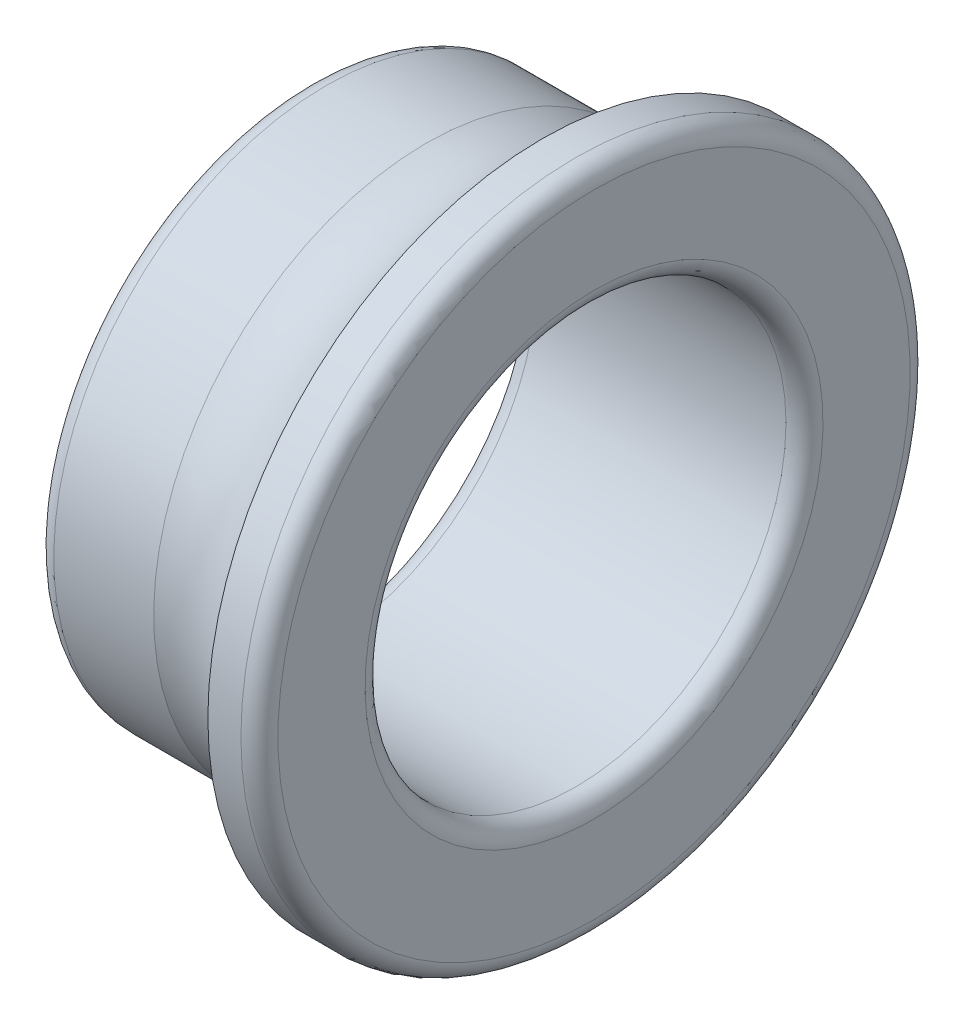
ISO-10303-21;
HEADER;
FILE_DESCRIPTION(('STEP AP214'),'2;1');
FILE_NAME('part.step','',(''),(''),'','','');
FILE_SCHEMA(('AUTOMOTIVE_DESIGN { 1 0 10303 214 1 1 1 1 }'));
ENDSEC;
DATA;
#1=APPLICATION_CONTEXT('core data for automotive mechanical design processes');
#2=APPLICATION_PROTOCOL_DEFINITION('international standard','automotive_design',2000,#1);
#3=PRODUCT_CONTEXT('',#1,'mechanical');
#4=PRODUCT('Part','Part','',(#3));
#5=PRODUCT_RELATED_PRODUCT_CATEGORY('part','',(#4));
#6=PRODUCT_DEFINITION_FORMATION('','',#4);
#7=PRODUCT_DEFINITION_CONTEXT('part definition',#1,'design');
#8=PRODUCT_DEFINITION('design','',#6,#7);
#9=PRODUCT_DEFINITION_SHAPE('','',#8);
#10=(LENGTH_UNIT() NAMED_UNIT(*) SI_UNIT(.MILLI.,.METRE.));
#11=(NAMED_UNIT(*) PLANE_ANGLE_UNIT() SI_UNIT($,.RADIAN.));
#12=(NAMED_UNIT(*) SI_UNIT($,.STERADIAN.) SOLID_ANGLE_UNIT());
#13=UNCERTAINTY_MEASURE_WITH_UNIT(LENGTH_MEASURE(1.E-05),#10,'distance_accuracy_value','');
#14=(GEOMETRIC_REPRESENTATION_CONTEXT(3) GLOBAL_UNCERTAINTY_ASSIGNED_CONTEXT((#13)) GLOBAL_UNIT_ASSIGNED_CONTEXT((#10,
#11,#12)) REPRESENTATION_CONTEXT('',''));
#15=CARTESIAN_POINT('',(0.,0.,0.));
#16=DIRECTION('',(0.,0.,1.));
#17=DIRECTION('',(1.,0.,0.));
#18=AXIS2_PLACEMENT_3D('',#15,#16,#17);
#19=CARTESIAN_POINT('',(15.9,0.,0.));
#20=DIRECTION('',(1.,0.,0.));
#21=DIRECTION('',(0.,0.,-1.));
#22=AXIS2_PLACEMENT_3D('',#19,#20,#21);
#23=TOROIDAL_SURFACE('',#22,13.6,1.1);
#24=CARTESIAN_POINT('',(17.,0.,0.));
#25=DIRECTION('',(1.,0.,0.));
#26=DIRECTION('',(0.,1.,0.));
#27=AXIS2_PLACEMENT_3D('',#24,#25,#26);
#28=CIRCLE('',#27,13.6);
#29=CARTESIAN_POINT('',(17.,13.6,0.));
#30=VERTEX_POINT('',#29);
#31=EDGE_CURVE('E11',#30,#30,#28,.T.);
#32=ORIENTED_EDGE('',*,*,#31,.T.);
#33=EDGE_LOOP('',(#32));
#34=FACE_BOUND('',#33,.T.);
#35=CARTESIAN_POINT('',(15.9,0.,0.));
#36=DIRECTION('',(1.,0.,0.));
#37=DIRECTION('',(0.,1.,0.));
#38=AXIS2_PLACEMENT_3D('',#35,#36,#37);
#39=CIRCLE('',#38,12.5);
#40=CARTESIAN_POINT('',(15.9,12.5,0.));
#41=VERTEX_POINT('',#40);
#42=EDGE_CURVE('E56',#41,#41,#39,.T.);
#43=ORIENTED_EDGE('',*,*,#42,.F.);
#44=EDGE_LOOP('',(#43));
#45=FACE_BOUND('',#44,.T.);
#46=ADVANCED_FACE('F16',(#34,#45),#23,.T.);
#47=CARTESIAN_POINT('',(17.,16.1875,0.));
#48=DIRECTION('',(1.,0.,0.));
#49=DIRECTION('',(0.,1.,0.));
#50=AXIS2_PLACEMENT_3D('',#47,#48,#49);
#51=PLANE('',#50);
#52=CARTESIAN_POINT('',(17.,0.,0.));
#53=DIRECTION('',(1.,0.,0.));
#54=DIRECTION('',(0.,1.,0.));
#55=AXIS2_PLACEMENT_3D('',#52,#53,#54);
#56=CIRCLE('',#55,18.775);
#57=CARTESIAN_POINT('',(17.,18.775,0.));
#58=VERTEX_POINT('',#57);
#59=EDGE_CURVE('E26',#58,#58,#56,.T.);
#60=ORIENTED_EDGE('',*,*,#59,.T.);
#61=EDGE_LOOP('',(#60));
#62=FACE_BOUND('',#61,.T.);
#63=ORIENTED_EDGE('',*,*,#31,.F.);
#64=EDGE_LOOP('',(#63));
#65=FACE_BOUND('',#64,.T.);
#66=ADVANCED_FACE('F18',(#62,#65),#51,.T.);
#67=CARTESIAN_POINT('',(15.9,0.,0.));
#68=DIRECTION('',(1.,0.,0.));
#69=DIRECTION('',(0.,0.,-1.));
#70=AXIS2_PLACEMENT_3D('',#67,#68,#69);
#71=TOROIDAL_SURFACE('',#70,18.775,1.1);
#72=CARTESIAN_POINT('',(15.9,0.,0.));
#73=DIRECTION('',(1.,0.,0.));
#74=DIRECTION('',(0.,1.,0.));
#75=AXIS2_PLACEMENT_3D('',#72,#73,#74);
#76=CIRCLE('',#75,19.875);
#77=CARTESIAN_POINT('',(15.9,19.875,0.));
#78=VERTEX_POINT('',#77);
#79=EDGE_CURVE('E73',#78,#78,#76,.T.);
#80=ORIENTED_EDGE('',*,*,#79,.T.);
#81=EDGE_LOOP('',(#80));
#82=FACE_BOUND('',#81,.T.);
#83=ORIENTED_EDGE('',*,*,#59,.F.);
#84=EDGE_LOOP('',(#83));
#85=FACE_BOUND('',#84,.T.);
#86=ADVANCED_FACE('F103',(#82,#85),#71,.T.);
#87=CARTESIAN_POINT('',(14.9178518631449,0.,0.));
#88=DIRECTION('',(-1.,0.,0.));
#89=DIRECTION('',(0.,1.,0.));
#90=AXIS2_PLACEMENT_3D('',#87,#88,#89);
#91=CYLINDRICAL_SURFACE('',#90,19.875);
#92=CARTESIAN_POINT('',(13.9357037262897,0.,0.));
#93=DIRECTION('',(1.,0.,0.));
#94=DIRECTION('',(0.,1.,0.));
#95=AXIS2_PLACEMENT_3D('',#92,#93,#94);
#96=CIRCLE('',#95,19.875);
#97=CARTESIAN_POINT('',(13.9357037262897,19.875,0.));
#98=VERTEX_POINT('',#97);
#99=EDGE_CURVE('E71',#98,#98,#96,.T.);
#100=ORIENTED_EDGE('',*,*,#99,.T.);
#101=EDGE_LOOP('',(#100));
#102=FACE_BOUND('',#101,.T.);
#103=ORIENTED_EDGE('',*,*,#79,.F.);
#104=EDGE_LOOP('',(#103));
#105=FACE_BOUND('',#104,.T.);
#106=ADVANCED_FACE('F108',(#102,#105),#91,.T.);
#107=CARTESIAN_POINT('',(8.5,0.,0.));
#108=DIRECTION('',(1.,0.,0.));
#109=DIRECTION('',(0.,0.,-1.));
#110=AXIS2_PLACEMENT_3D('',#107,#108,#109);
#111=TOROIDAL_SURFACE('',#110,21.75,5.75);
#112=CARTESIAN_POINT('',(7.03408731501495,0.,0.));
#113=DIRECTION('',(1.,0.,0.));
#114=DIRECTION('',(0.,1.,0.));
#115=AXIS2_PLACEMENT_3D('',#112,#113,#114);
#116=CIRCLE('',#115,16.19);
#117=CARTESIAN_POINT('',(7.03408731501495,16.19,0.));
#118=VERTEX_POINT('',#117);
#119=EDGE_CURVE('E74',#118,#118,#116,.T.);
#120=ORIENTED_EDGE('',*,*,#119,.T.);
#121=EDGE_LOOP('',(#120));
#122=FACE_BOUND('',#121,.T.);
#123=ORIENTED_EDGE('',*,*,#99,.F.);
#124=EDGE_LOOP('',(#123));
#125=FACE_BOUND('',#124,.T.);
#126=ADVANCED_FACE('F95',(#122,#125),#111,.F.);
#127=CARTESIAN_POINT('',(4.06704365750748,0.,0.));
#128=DIRECTION('',(-1.,0.,0.));
#129=DIRECTION('',(0.,1.,0.));
#130=AXIS2_PLACEMENT_3D('',#127,#128,#129);
#131=CYLINDRICAL_SURFACE('',#130,16.19);
#132=CARTESIAN_POINT('',(1.1,0.,0.));
#133=DIRECTION('',(1.,0.,0.));
#134=DIRECTION('',(0.,1.,0.));
#135=AXIS2_PLACEMENT_3D('',#132,#133,#134);
#136=CIRCLE('',#135,16.19);
#137=CARTESIAN_POINT('',(1.1,16.19,0.));
#138=VERTEX_POINT('',#137);
#139=EDGE_CURVE('E20',#138,#138,#136,.T.);
#140=ORIENTED_EDGE('',*,*,#139,.T.);
#141=EDGE_LOOP('',(#140));
#142=FACE_BOUND('',#141,.T.);
#143=ORIENTED_EDGE('',*,*,#119,.F.);
#144=EDGE_LOOP('',(#143));
#145=FACE_BOUND('',#144,.T.);
#146=ADVANCED_FACE('F81',(#142,#145),#131,.T.);
#147=CARTESIAN_POINT('',(1.1,0.,0.));
#148=DIRECTION('',(1.,0.,0.));
#149=DIRECTION('',(0.,0.,-1.));
#150=AXIS2_PLACEMENT_3D('',#147,#148,#149);
#151=TOROIDAL_SURFACE('',#150,15.09,1.1);
#152=CARTESIAN_POINT('',(0.,0.,0.));
#153=DIRECTION('',(1.,0.,0.));
#154=DIRECTION('',(0.,1.,0.));
#155=AXIS2_PLACEMENT_3D('',#152,#153,#154);
#156=CIRCLE('',#155,15.09);
#157=CARTESIAN_POINT('',(0.,15.09,0.));
#158=VERTEX_POINT('',#157);
#159=EDGE_CURVE('E65',#158,#158,#156,.T.);
#160=ORIENTED_EDGE('',*,*,#159,.T.);
#161=EDGE_LOOP('',(#160));
#162=FACE_BOUND('',#161,.T.);
#163=ORIENTED_EDGE('',*,*,#139,.F.);
#164=EDGE_LOOP('',(#163));
#165=FACE_BOUND('',#164,.T.);
#166=ADVANCED_FACE('F84',(#162,#165),#151,.T.);
#167=CARTESIAN_POINT('',(0.,14.345,0.));
#168=DIRECTION('',(-1.,0.,0.));
#169=DIRECTION('',(0.,-1.,0.));
#170=AXIS2_PLACEMENT_3D('',#167,#168,#169);
#171=PLANE('',#170);
#172=CARTESIAN_POINT('',(0.,0.,0.));
#173=DIRECTION('',(1.,0.,0.));
#174=DIRECTION('',(0.,1.,0.));
#175=AXIS2_PLACEMENT_3D('',#172,#173,#174);
#176=CIRCLE('',#175,13.6);
#177=CARTESIAN_POINT('',(0.,13.6,0.));
#178=VERTEX_POINT('',#177);
#179=EDGE_CURVE('E61',#178,#178,#176,.T.);
#180=ORIENTED_EDGE('',*,*,#179,.T.);
#181=EDGE_LOOP('',(#180));
#182=FACE_BOUND('',#181,.T.);
#183=ORIENTED_EDGE('',*,*,#159,.F.);
#184=EDGE_LOOP('',(#183));
#185=FACE_BOUND('',#184,.T.);
#186=ADVANCED_FACE('F62',(#182,#185),#171,.T.);
#187=CARTESIAN_POINT('',(1.1,0.,0.));
#188=DIRECTION('',(1.,0.,0.));
#189=DIRECTION('',(0.,0.,-1.));
#190=AXIS2_PLACEMENT_3D('',#187,#188,#189);
#191=TOROIDAL_SURFACE('',#190,13.6,1.1);
#192=CARTESIAN_POINT('',(1.1,0.,0.));
#193=DIRECTION('',(1.,0.,0.));
#194=DIRECTION('',(0.,1.,0.));
#195=AXIS2_PLACEMENT_3D('',#192,#193,#194);
#196=CIRCLE('',#195,12.5);
#197=CARTESIAN_POINT('',(1.1,12.5,0.));
#198=VERTEX_POINT('',#197);
#199=EDGE_CURVE('E52',#198,#198,#196,.T.);
#200=ORIENTED_EDGE('',*,*,#199,.T.);
#201=EDGE_LOOP('',(#200));
#202=FACE_BOUND('',#201,.T.);
#203=ORIENTED_EDGE('',*,*,#179,.F.);
#204=EDGE_LOOP('',(#203));
#205=FACE_BOUND('',#204,.T.);
#206=ADVANCED_FACE('F93',(#202,#205),#191,.T.);
#207=CARTESIAN_POINT('',(8.5,0.,0.));
#208=DIRECTION('',(-1.,0.,0.));
#209=DIRECTION('',(0.,1.,0.));
#210=AXIS2_PLACEMENT_3D('',#207,#208,#209);
#211=CYLINDRICAL_SURFACE('',#210,12.5);
#212=ORIENTED_EDGE('',*,*,#42,.T.);
#213=EDGE_LOOP('',(#212));
#214=FACE_BOUND('',#213,.T.);
#215=ORIENTED_EDGE('',*,*,#199,.F.);
#216=EDGE_LOOP('',(#215));
#217=FACE_BOUND('',#216,.T.);
#218=ADVANCED_FACE('F175',(#214,#217),#211,.F.);
#219=CLOSED_SHELL('',(#46,#66,#86,#106,#126,#146,#166,#186,#206,#218));
#220=MANIFOLD_SOLID_BREP('B1',#219);
#221=ADVANCED_BREP_SHAPE_REPRESENTATION('',(#18,#220),#14);
#222=SHAPE_DEFINITION_REPRESENTATION(#9,#221);
ENDSEC;
END-ISO-10303-21;
